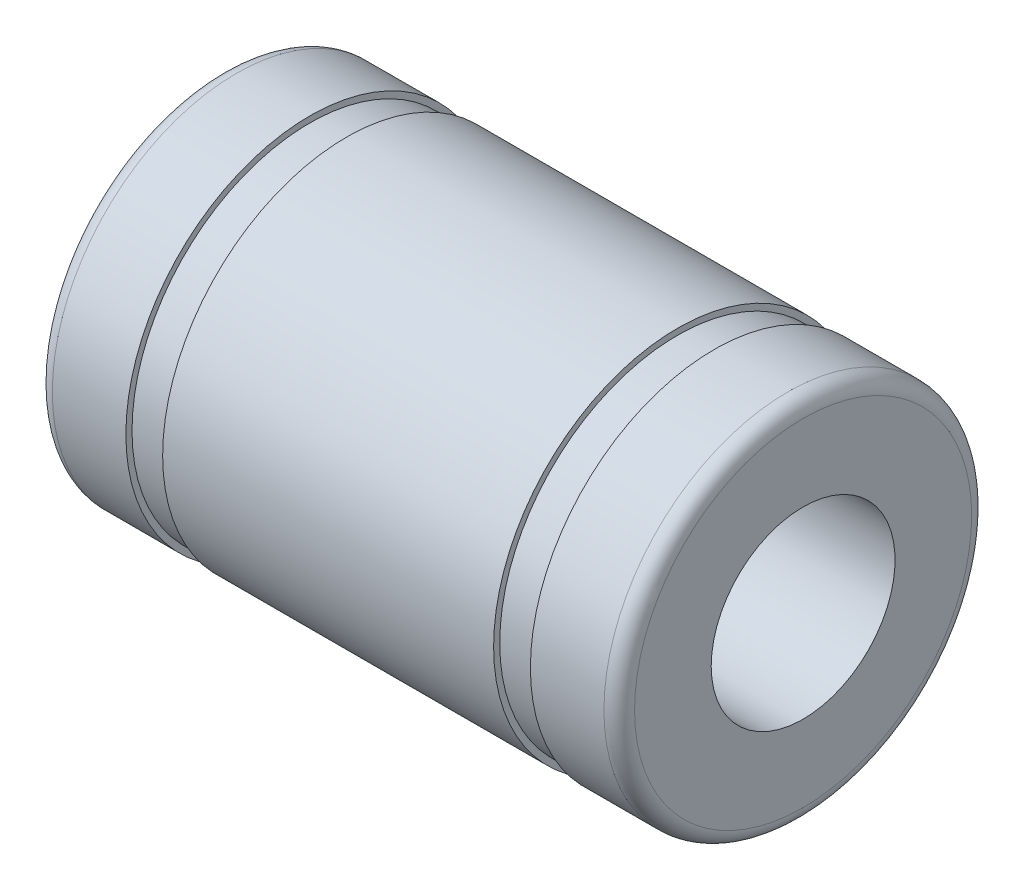
ISO-10303-21;
HEADER;
FILE_DESCRIPTION(('STEP AP214'),'2;1');
FILE_NAME('part.step','',(''),(''),'','','');
FILE_SCHEMA(('AUTOMOTIVE_DESIGN { 1 0 10303 214 1 1 1 1 }'));
ENDSEC;
DATA;
#1=APPLICATION_CONTEXT('core data for automotive mechanical design processes');
#2=APPLICATION_PROTOCOL_DEFINITION('international standard','automotive_design',2000,#1);
#3=PRODUCT_CONTEXT('',#1,'mechanical');
#4=PRODUCT('Part','Part','',(#3));
#5=PRODUCT_RELATED_PRODUCT_CATEGORY('part','',(#4));
#6=PRODUCT_DEFINITION_FORMATION('','',#4);
#7=PRODUCT_DEFINITION_CONTEXT('part definition',#1,'design');
#8=PRODUCT_DEFINITION('design','',#6,#7);
#9=PRODUCT_DEFINITION_SHAPE('','',#8);
#10=(LENGTH_UNIT() NAMED_UNIT(*) SI_UNIT(.MILLI.,.METRE.));
#11=(NAMED_UNIT(*) PLANE_ANGLE_UNIT() SI_UNIT($,.RADIAN.));
#12=(NAMED_UNIT(*) SI_UNIT($,.STERADIAN.) SOLID_ANGLE_UNIT());
#13=UNCERTAINTY_MEASURE_WITH_UNIT(LENGTH_MEASURE(1.E-05),#10,'distance_accuracy_value','');
#14=(GEOMETRIC_REPRESENTATION_CONTEXT(3) GLOBAL_UNCERTAINTY_ASSIGNED_CONTEXT((#13)) GLOBAL_UNIT_ASSIGNED_CONTEXT((#10,
#11,#12)) REPRESENTATION_CONTEXT('',''));
#15=CARTESIAN_POINT('',(0.,0.,0.));
#16=DIRECTION('',(0.,0.,1.));
#17=DIRECTION('',(1.,0.,0.));
#18=AXIS2_PLACEMENT_3D('',#15,#16,#17);
#19=CARTESIAN_POINT('',(-9.5,0.,-6.));
#20=DIRECTION('',(1.,0.,0.));
#21=DIRECTION('',(0.,0.,-1.));
#22=AXIS2_PLACEMENT_3D('',#19,#20,#21);
#23=PLANE('',#22);
#24=CARTESIAN_POINT('',(-9.5,0.,0.));
#25=DIRECTION('',(1.,0.,0.));
#26=DIRECTION('',(0.,0.,-1.));
#27=AXIS2_PLACEMENT_3D('',#24,#25,#26);
#28=CIRCLE('',#27,5.5);
#29=CARTESIAN_POINT('',(-9.5,0.,-5.5));
#30=VERTEX_POINT('',#29);
#31=EDGE_CURVE('E46',#30,#30,#28,.F.);
#32=ORIENTED_EDGE('',*,*,#31,.T.);
#33=EDGE_LOOP('',(#32));
#34=FACE_BOUND('',#33,.T.);
#35=CARTESIAN_POINT('',(-9.5,0.,0.));
#36=DIRECTION('',(-1.,0.,0.));
#37=DIRECTION('',(0.,0.,1.));
#38=AXIS2_PLACEMENT_3D('',#35,#36,#37);
#39=CIRCLE('',#38,3.);
#40=CARTESIAN_POINT('',(-9.5,0.,3.));
#41=VERTEX_POINT('',#40);
#42=EDGE_CURVE('E78',#41,#41,#39,.T.);
#43=ORIENTED_EDGE('',*,*,#42,.F.);
#44=EDGE_LOOP('',(#43));
#45=FACE_BOUND('',#44,.T.);
#46=ADVANCED_FACE('F31',(#34,#45),#23,.F.);
#47=CARTESIAN_POINT('',(0.,0.,0.));
#48=DIRECTION('',(-1.,0.,0.));
#49=DIRECTION('',(0.,0.,1.));
#50=AXIS2_PLACEMENT_3D('',#47,#48,#49);
#51=CYLINDRICAL_SURFACE('',#50,6.);
#52=CARTESIAN_POINT('',(-9.,0.,0.));
#53=DIRECTION('',(1.,0.,0.));
#54=DIRECTION('',(0.,0.,-1.));
#55=AXIS2_PLACEMENT_3D('',#52,#53,#54);
#56=CIRCLE('',#55,6.);
#57=CARTESIAN_POINT('',(-9.,0.,-6.));
#58=VERTEX_POINT('',#57);
#59=EDGE_CURVE('E42',#58,#58,#56,.T.);
#60=ORIENTED_EDGE('',*,*,#59,.T.);
#61=EDGE_LOOP('',(#60));
#62=FACE_BOUND('',#61,.T.);
#63=CARTESIAN_POINT('',(-6.6,0.,0.));
#64=DIRECTION('',(-1.,0.,0.));
#65=DIRECTION('',(0.,0.,1.));
#66=AXIS2_PLACEMENT_3D('',#63,#64,#65);
#67=CIRCLE('',#66,6.);
#68=CARTESIAN_POINT('',(-6.6,0.,6.));
#69=VERTEX_POINT('',#68);
#70=EDGE_CURVE('E51',#69,#69,#67,.T.);
#71=ORIENTED_EDGE('',*,*,#70,.T.);
#72=EDGE_LOOP('',(#71));
#73=FACE_BOUND('',#72,.T.);
#74=ADVANCED_FACE('F85',(#62,#73),#51,.T.);
#75=CARTESIAN_POINT('',(-6.6,0.,-5.8));
#76=DIRECTION('',(-1.,0.,0.));
#77=DIRECTION('',(0.,0.,1.));
#78=AXIS2_PLACEMENT_3D('',#75,#76,#77);
#79=PLANE('',#78);
#80=ORIENTED_EDGE('',*,*,#70,.F.);
#81=EDGE_LOOP('',(#80));
#82=FACE_BOUND('',#81,.T.);
#83=CARTESIAN_POINT('',(-6.6,0.,0.));
#84=DIRECTION('',(-1.,0.,0.));
#85=DIRECTION('',(0.,0.,1.));
#86=AXIS2_PLACEMENT_3D('',#83,#84,#85);
#87=CIRCLE('',#86,5.8);
#88=CARTESIAN_POINT('',(-6.6,0.,5.8));
#89=VERTEX_POINT('',#88);
#90=EDGE_CURVE('E54',#89,#89,#87,.T.);
#91=ORIENTED_EDGE('',*,*,#90,.T.);
#92=EDGE_LOOP('',(#91));
#93=FACE_BOUND('',#92,.T.);
#94=ADVANCED_FACE('F91',(#82,#93),#79,.F.);
#95=CARTESIAN_POINT('',(0.,0.,0.));
#96=DIRECTION('',(-1.,0.,0.));
#97=DIRECTION('',(0.,0.,1.));
#98=AXIS2_PLACEMENT_3D('',#95,#96,#97);
#99=CYLINDRICAL_SURFACE('',#98,5.8);
#100=ORIENTED_EDGE('',*,*,#90,.F.);
#101=EDGE_LOOP('',(#100));
#102=FACE_BOUND('',#101,.T.);
#103=CARTESIAN_POINT('',(-5.4,0.,0.));
#104=DIRECTION('',(-1.,0.,0.));
#105=DIRECTION('',(0.,0.,1.));
#106=AXIS2_PLACEMENT_3D('',#103,#104,#105);
#107=CIRCLE('',#106,5.8);
#108=CARTESIAN_POINT('',(-5.4,0.,5.8));
#109=VERTEX_POINT('',#108);
#110=EDGE_CURVE('E57',#109,#109,#107,.T.);
#111=ORIENTED_EDGE('',*,*,#110,.T.);
#112=EDGE_LOOP('',(#111));
#113=FACE_BOUND('',#112,.T.);
#114=ADVANCED_FACE('F114',(#102,#113),#99,.T.);
#115=CARTESIAN_POINT('',(-5.4,0.,-6.));
#116=DIRECTION('',(1.,0.,0.));
#117=DIRECTION('',(0.,0.,-1.));
#118=AXIS2_PLACEMENT_3D('',#115,#116,#117);
#119=PLANE('',#118);
#120=ORIENTED_EDGE('',*,*,#110,.F.);
#121=EDGE_LOOP('',(#120));
#122=FACE_BOUND('',#121,.T.);
#123=CARTESIAN_POINT('',(-5.4,0.,0.));
#124=DIRECTION('',(-1.,0.,0.));
#125=DIRECTION('',(0.,0.,1.));
#126=AXIS2_PLACEMENT_3D('',#123,#124,#125);
#127=CIRCLE('',#126,6.);
#128=CARTESIAN_POINT('',(-5.4,0.,6.));
#129=VERTEX_POINT('',#128);
#130=EDGE_CURVE('E60',#129,#129,#127,.T.);
#131=ORIENTED_EDGE('',*,*,#130,.T.);
#132=EDGE_LOOP('',(#131));
#133=FACE_BOUND('',#132,.T.);
#134=ADVANCED_FACE('F119',(#122,#133),#119,.F.);
#135=CARTESIAN_POINT('',(0.,0.,0.));
#136=DIRECTION('',(-1.,0.,0.));
#137=DIRECTION('',(0.,0.,1.));
#138=AXIS2_PLACEMENT_3D('',#135,#136,#137);
#139=CYLINDRICAL_SURFACE('',#138,6.);
#140=ORIENTED_EDGE('',*,*,#130,.F.);
#141=EDGE_LOOP('',(#140));
#142=FACE_BOUND('',#141,.T.);
#143=CARTESIAN_POINT('',(5.4,0.,0.));
#144=DIRECTION('',(-1.,0.,0.));
#145=DIRECTION('',(0.,0.,1.));
#146=AXIS2_PLACEMENT_3D('',#143,#144,#145);
#147=CIRCLE('',#146,6.);
#148=CARTESIAN_POINT('',(5.4,0.,6.));
#149=VERTEX_POINT('',#148);
#150=EDGE_CURVE('E63',#149,#149,#147,.T.);
#151=ORIENTED_EDGE('',*,*,#150,.T.);
#152=EDGE_LOOP('',(#151));
#153=FACE_BOUND('',#152,.T.);
#154=ADVANCED_FACE('F125',(#142,#153),#139,.T.);
#155=CARTESIAN_POINT('',(5.4,0.,-6.));
#156=DIRECTION('',(-1.,0.,0.));
#157=DIRECTION('',(0.,0.,1.));
#158=AXIS2_PLACEMENT_3D('',#155,#156,#157);
#159=PLANE('',#158);
#160=ORIENTED_EDGE('',*,*,#150,.F.);
#161=EDGE_LOOP('',(#160));
#162=FACE_BOUND('',#161,.T.);
#163=CARTESIAN_POINT('',(5.4,0.,0.));
#164=DIRECTION('',(-1.,0.,0.));
#165=DIRECTION('',(0.,0.,1.));
#166=AXIS2_PLACEMENT_3D('',#163,#164,#165);
#167=CIRCLE('',#166,5.8);
#168=CARTESIAN_POINT('',(5.4,0.,5.8));
#169=VERTEX_POINT('',#168);
#170=EDGE_CURVE('E66',#169,#169,#167,.T.);
#171=ORIENTED_EDGE('',*,*,#170,.T.);
#172=EDGE_LOOP('',(#171));
#173=FACE_BOUND('',#172,.T.);
#174=ADVANCED_FACE('F131',(#162,#173),#159,.F.);
#175=CARTESIAN_POINT('',(0.,0.,0.));
#176=DIRECTION('',(-1.,0.,0.));
#177=DIRECTION('',(0.,0.,1.));
#178=AXIS2_PLACEMENT_3D('',#175,#176,#177);
#179=CYLINDRICAL_SURFACE('',#178,5.8);
#180=ORIENTED_EDGE('',*,*,#170,.F.);
#181=EDGE_LOOP('',(#180));
#182=FACE_BOUND('',#181,.T.);
#183=CARTESIAN_POINT('',(6.6,0.,0.));
#184=DIRECTION('',(-1.,0.,0.));
#185=DIRECTION('',(0.,0.,1.));
#186=AXIS2_PLACEMENT_3D('',#183,#184,#185);
#187=CIRCLE('',#186,5.8);
#188=CARTESIAN_POINT('',(6.6,0.,5.8));
#189=VERTEX_POINT('',#188);
#190=EDGE_CURVE('E69',#189,#189,#187,.T.);
#191=ORIENTED_EDGE('',*,*,#190,.T.);
#192=EDGE_LOOP('',(#191));
#193=FACE_BOUND('',#192,.T.);
#194=ADVANCED_FACE('F137',(#182,#193),#179,.T.);
#195=CARTESIAN_POINT('',(6.6,0.,-5.8));
#196=DIRECTION('',(1.,0.,0.));
#197=DIRECTION('',(0.,0.,-1.));
#198=AXIS2_PLACEMENT_3D('',#195,#196,#197);
#199=PLANE('',#198);
#200=ORIENTED_EDGE('',*,*,#190,.F.);
#201=EDGE_LOOP('',(#200));
#202=FACE_BOUND('',#201,.T.);
#203=CARTESIAN_POINT('',(6.6,0.,0.));
#204=DIRECTION('',(-1.,0.,0.));
#205=DIRECTION('',(0.,0.,1.));
#206=AXIS2_PLACEMENT_3D('',#203,#204,#205);
#207=CIRCLE('',#206,6.);
#208=CARTESIAN_POINT('',(6.6,0.,6.));
#209=VERTEX_POINT('',#208);
#210=EDGE_CURVE('E72',#209,#209,#207,.T.);
#211=ORIENTED_EDGE('',*,*,#210,.T.);
#212=EDGE_LOOP('',(#211));
#213=FACE_BOUND('',#212,.T.);
#214=ADVANCED_FACE('F143',(#202,#213),#199,.F.);
#215=CARTESIAN_POINT('',(0.,0.,0.));
#216=DIRECTION('',(-1.,0.,0.));
#217=DIRECTION('',(0.,0.,1.));
#218=AXIS2_PLACEMENT_3D('',#215,#216,#217);
#219=CYLINDRICAL_SURFACE('',#218,6.);
#220=CARTESIAN_POINT('',(9.,0.,0.));
#221=DIRECTION('',(-1.,0.,0.));
#222=DIRECTION('',(0.,0.,1.));
#223=AXIS2_PLACEMENT_3D('',#220,#221,#222);
#224=CIRCLE('',#223,6.);
#225=CARTESIAN_POINT('',(9.,0.,6.));
#226=VERTEX_POINT('',#225);
#227=EDGE_CURVE('E38',#226,#226,#224,.T.);
#228=ORIENTED_EDGE('',*,*,#227,.T.);
#229=EDGE_LOOP('',(#228));
#230=FACE_BOUND('',#229,.T.);
#231=ORIENTED_EDGE('',*,*,#210,.F.);
#232=EDGE_LOOP('',(#231));
#233=FACE_BOUND('',#232,.T.);
#234=ADVANCED_FACE('F149',(#230,#233),#219,.T.);
#235=CARTESIAN_POINT('',(9.5,0.,-6.));
#236=DIRECTION('',(-1.,0.,0.));
#237=DIRECTION('',(0.,0.,1.));
#238=AXIS2_PLACEMENT_3D('',#235,#236,#237);
#239=PLANE('',#238);
#240=CARTESIAN_POINT('',(9.5,0.,0.));
#241=DIRECTION('',(-1.,0.,0.));
#242=DIRECTION('',(0.,0.,1.));
#243=AXIS2_PLACEMENT_3D('',#240,#241,#242);
#244=CIRCLE('',#243,5.5);
#245=CARTESIAN_POINT('',(9.5,0.,5.5));
#246=VERTEX_POINT('',#245);
#247=EDGE_CURVE('E10',#246,#246,#244,.F.);
#248=ORIENTED_EDGE('',*,*,#247,.T.);
#249=EDGE_LOOP('',(#248));
#250=FACE_BOUND('',#249,.T.);
#251=CARTESIAN_POINT('',(9.5,0.,0.));
#252=DIRECTION('',(-1.,0.,0.));
#253=DIRECTION('',(0.,0.,1.));
#254=AXIS2_PLACEMENT_3D('',#251,#252,#253);
#255=CIRCLE('',#254,3.);
#256=CARTESIAN_POINT('',(9.5,0.,3.));
#257=VERTEX_POINT('',#256);
#258=EDGE_CURVE('E75',#257,#257,#255,.T.);
#259=ORIENTED_EDGE('',*,*,#258,.T.);
#260=EDGE_LOOP('',(#259));
#261=FACE_BOUND('',#260,.T.);
#262=ADVANCED_FACE('F103',(#250,#261),#239,.F.);
#263=CARTESIAN_POINT('',(0.,0.,0.));
#264=DIRECTION('',(-1.,0.,0.));
#265=DIRECTION('',(0.,0.,1.));
#266=AXIS2_PLACEMENT_3D('',#263,#264,#265);
#267=CYLINDRICAL_SURFACE('',#266,3.);
#268=ORIENTED_EDGE('',*,*,#258,.F.);
#269=EDGE_LOOP('',(#268));
#270=FACE_BOUND('',#269,.T.);
#271=ORIENTED_EDGE('',*,*,#42,.T.);
#272=EDGE_LOOP('',(#271));
#273=FACE_BOUND('',#272,.T.);
#274=ADVANCED_FACE('F82',(#270,#273),#267,.F.);
#275=CARTESIAN_POINT('',(-9.,0.,0.));
#276=DIRECTION('',(1.,0.,0.));
#277=DIRECTION('',(0.,0.,-1.));
#278=AXIS2_PLACEMENT_3D('',#275,#276,#277);
#279=TOROIDAL_SURFACE('',#278,5.5,0.5);
#280=ORIENTED_EDGE('',*,*,#59,.F.);
#281=EDGE_LOOP('',(#280));
#282=FACE_BOUND('',#281,.T.);
#283=ORIENTED_EDGE('',*,*,#31,.F.);
#284=EDGE_LOOP('',(#283));
#285=FACE_BOUND('',#284,.T.);
#286=ADVANCED_FACE('F95',(#282,#285),#279,.T.);
#287=CARTESIAN_POINT('',(9.,0.,0.));
#288=DIRECTION('',(-1.,0.,0.));
#289=DIRECTION('',(0.,0.,1.));
#290=AXIS2_PLACEMENT_3D('',#287,#288,#289);
#291=TOROIDAL_SURFACE('',#290,5.5,0.5);
#292=ORIENTED_EDGE('',*,*,#247,.F.);
#293=EDGE_LOOP('',(#292));
#294=FACE_BOUND('',#293,.T.);
#295=ORIENTED_EDGE('',*,*,#227,.F.);
#296=EDGE_LOOP('',(#295));
#297=FACE_BOUND('',#296,.T.);
#298=ADVANCED_FACE('F33',(#294,#297),#291,.T.);
#299=CLOSED_SHELL('',(#46,#74,#94,#114,#134,#154,#174,#194,#214,#234,#262,#274,#286,#298));
#300=MANIFOLD_SOLID_BREP('B2',#299);
#301=ADVANCED_BREP_SHAPE_REPRESENTATION('',(#18,#300),#14);
#302=SHAPE_DEFINITION_REPRESENTATION(#9,#301);
ENDSEC;
END-ISO-10303-21;
